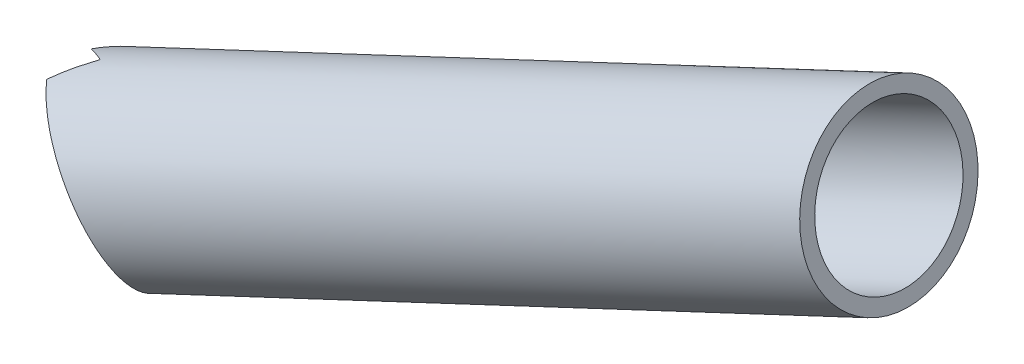
ISO-10303-21;
HEADER;
FILE_DESCRIPTION(('STEP AP214'),'2;1');
FILE_NAME('part.step','',(''),(''),'','','');
FILE_SCHEMA(('AUTOMOTIVE_DESIGN { 1 0 10303 214 1 1 1 1 }'));
ENDSEC;
DATA;
#1=APPLICATION_CONTEXT('core data for automotive mechanical design processes');
#2=APPLICATION_PROTOCOL_DEFINITION('international standard','automotive_design',2000,#1);
#3=PRODUCT_CONTEXT('',#1,'mechanical');
#4=PRODUCT('Part','Part','',(#3));
#5=PRODUCT_RELATED_PRODUCT_CATEGORY('part','',(#4));
#6=PRODUCT_DEFINITION_FORMATION('','',#4);
#7=PRODUCT_DEFINITION_CONTEXT('part definition',#1,'design');
#8=PRODUCT_DEFINITION('design','',#6,#7);
#9=PRODUCT_DEFINITION_SHAPE('','',#8);
#10=(LENGTH_UNIT() NAMED_UNIT(*) SI_UNIT(.MILLI.,.METRE.));
#11=(NAMED_UNIT(*) PLANE_ANGLE_UNIT() SI_UNIT($,.RADIAN.));
#12=(NAMED_UNIT(*) SI_UNIT($,.STERADIAN.) SOLID_ANGLE_UNIT());
#13=UNCERTAINTY_MEASURE_WITH_UNIT(LENGTH_MEASURE(1.E-05),#10,'distance_accuracy_value','');
#14=(GEOMETRIC_REPRESENTATION_CONTEXT(3) GLOBAL_UNCERTAINTY_ASSIGNED_CONTEXT((#13)) GLOBAL_UNIT_ASSIGNED_CONTEXT((#10,
#11,#12)) REPRESENTATION_CONTEXT('',''));
#15=CARTESIAN_POINT('',(0.,0.,0.));
#16=DIRECTION('',(0.,0.,1.));
#17=DIRECTION('',(1.,0.,0.));
#18=AXIS2_PLACEMENT_3D('',#15,#16,#17);
#19=CARTESIAN_POINT('',(-150.,499.999999999999,-1140.));
#20=DIRECTION('',(0.904818702200994,0.425797036329879,0.));
#21=DIRECTION('',(-0.425797036329879,0.904818702200994,0.));
#22=AXIS2_PLACEMENT_3D('',#19,#20,#21);
#23=CYLINDRICAL_SURFACE('',#22,7.90000000000002);
#24=CARTESIAN_POINT('',(-64.9999999999999,539.999999999999,-1140.));
#25=DIRECTION('',(0.975914622854119,0.218152810890676,0.));
#26=DIRECTION('',(-0.218152810890676,0.975914622854119,0.));
#27=AXIS2_PLACEMENT_3D('',#24,#25,#26);
#28=ELLIPSE('',#27,8.09497041544065,7.90000000000002);
#29=CARTESIAN_POINT('',(-66.7659405502051,547.899999999999,-1140.));
#30=VERTEX_POINT('',#29);
#31=EDGE_CURVE('E89',#30,#30,#28,.T.);
#32=ORIENTED_EDGE('',*,*,#31,.T.);
#33=EDGE_LOOP('',(#32));
#34=FACE_BOUND('',#33,.T.);
#35=CARTESIAN_POINT('',(-139.645473579607,502.874300322043,-1147.69027900345));
#36=CARTESIAN_POINT('',(-139.661307155204,502.71012741113,-1147.65692777421));
#37=CARTESIAN_POINT('',(-139.680305800371,502.547026325899,-1147.62000011917));
#38=CARTESIAN_POINT('',(-139.724004606069,502.22333632922,-1147.53943206389));
#39=CARTESIAN_POINT('',(-139.748702238356,502.062746337407,-1147.49579464316));
#40=CARTESIAN_POINT('',(-139.8031367204,501.744586324557,-1147.4023006833));
#41=CARTESIAN_POINT('',(-139.832864465143,501.58701140961,-1147.35245542328));
#42=CARTESIAN_POINT('',(-139.896817509264,501.274791150861,-1147.24681581513));
#43=CARTESIAN_POINT('',(-139.931043367525,501.120146173835,-1147.19102072791));
#44=CARTESIAN_POINT('',(-140.040383565727,500.657751620872,-1147.01393897515));
#45=CARTESIAN_POINT('',(-140.121593660903,500.354738724753,-1146.88390330433));
#46=CARTESIAN_POINT('',(-140.295862847536,499.762497282339,-1146.60210195336));
#47=CARTESIAN_POINT('',(-140.388926909799,499.473274589114,-1146.45032715386));
#48=CARTESIAN_POINT('',(-140.572909715701,498.938021989174,-1146.1415368896));
#49=CARTESIAN_POINT('',(-140.663112099239,498.690565254416,-1145.98656378264));
#50=CARTESIAN_POINT('',(-140.846185719115,498.208921163259,-1145.6584181483));
#51=CARTESIAN_POINT('',(-140.939057628674,497.974737199124,-1145.4852410003));
#52=CARTESIAN_POINT('',(-141.122805398781,497.522656478999,-1145.11984898213));
#53=CARTESIAN_POINT('',(-141.213688341121,497.304691414205,-1144.92772293803));
#54=CARTESIAN_POINT('',(-141.388267624243,496.887496000139,-1144.52146156504));
#55=CARTESIAN_POINT('',(-141.471973135809,496.688241711692,-1144.30735511395));
#56=CARTESIAN_POINT('',(-141.620473300655,496.324571581432,-1143.866631949));
#57=CARTESIAN_POINT('',(-141.686076278242,496.158814271204,-1143.64143330498));
#58=CARTESIAN_POINT('',(-141.768825677624,495.932395749011,-1143.28622700343));
#59=CARTESIAN_POINT('',(-141.793784279502,495.860680080498,-1143.1650397096));
#60=CARTESIAN_POINT('',(-141.837584240635,495.72573613113,-1142.91699919496));
#61=CARTESIAN_POINT('',(-141.856428723112,495.662503526658,-1142.79014890472));
#62=CARTESIAN_POINT('',(-141.887431689922,495.544956008496,-1142.52970596897));
#63=CARTESIAN_POINT('',(-141.899507121549,495.490757369196,-1142.39605062616));
#64=CARTESIAN_POINT('',(-141.916187868538,495.393255121579,-1142.12436686557));
#65=CARTESIAN_POINT('',(-141.920793739748,495.34995070277,-1141.98633877396));
#66=CARTESIAN_POINT('',(-141.922598374132,495.274884129779,-1141.70702707154));
#67=CARTESIAN_POINT('',(-141.919791792432,495.243130323145,-1141.56574118445));
#68=CARTESIAN_POINT('',(-141.90733422828,495.191408192572,-1141.28132934233));
#69=CARTESIAN_POINT('',(-141.897682329564,495.171441447016,-1141.1382031435));
#70=CARTESIAN_POINT('',(-141.871245588861,495.141629765395,-1140.83700672316));
#71=CARTESIAN_POINT('',(-141.853844355027,495.132995637518,-1140.67887235381));
#72=CARTESIAN_POINT('',(-141.813527270325,495.128903417962,-1140.36316278244));
#73=CARTESIAN_POINT('',(-141.790610542396,495.133447423108,-1140.20558767341));
#74=CARTESIAN_POINT('',(-141.740859187123,495.154717428475,-1139.89154126218));
#75=CARTESIAN_POINT('',(-141.714015564048,495.171471760757,-1139.73507338318));
#76=CARTESIAN_POINT('',(-141.657988649044,495.216147069046,-1139.42414740877));
#77=CARTESIAN_POINT('',(-141.628804560914,495.244071858119,-1139.26969001825));
#78=CARTESIAN_POINT('',(-141.556116407045,495.324993116705,-1138.89413881998));
#79=CARTESIAN_POINT('',(-141.51208084293,495.383617057423,-1138.67435268638));
#80=CARTESIAN_POINT('',(-141.425458854648,495.519855052602,-1138.24043717962));
#81=CARTESIAN_POINT('',(-141.382873033906,495.597476907068,-1138.02631017004));
#82=CARTESIAN_POINT('',(-141.30189156693,495.769857535135,-1137.60413235333));
#83=CARTESIAN_POINT('',(-141.263498088428,495.864625107606,-1137.39608472999));
#84=CARTESIAN_POINT('',(-141.193184670489,496.069788618251,-1136.98675382021));
#85=CARTESIAN_POINT('',(-141.161263887154,496.1801825159,-1136.78546965481));
#86=CARTESIAN_POINT('',(-141.105107029443,496.418285032886,-1136.38552378724));
#87=CARTESIAN_POINT('',(-141.081076349105,496.546348963318,-1136.18704440767));
#88=CARTESIAN_POINT('',(-141.043536568812,496.816538465366,-1135.79882516468));
#89=CARTESIAN_POINT('',(-141.030027890364,496.958664600049,-1135.60908565166));
#90=CARTESIAN_POINT('',(-141.015061064945,497.255820040646,-1135.23963864021));
#91=CARTESIAN_POINT('',(-141.013596185641,497.410842088942,-1135.05992559293));
#92=CARTESIAN_POINT('',(-141.024007385844,497.732714796871,-1134.71181290178));
#93=CARTESIAN_POINT('',(-141.035882887993,497.899564944302,-1134.54341276864));
#94=CARTESIAN_POINT('',(-141.073856612191,498.242094137159,-1134.22109127857));
#95=CARTESIAN_POINT('',(-141.099812034216,498.417668725494,-1134.06704244654));
#96=CARTESIAN_POINT('',(-141.16662154066,498.777701874792,-1133.77316601914));
#97=CARTESIAN_POINT('',(-141.207475824391,498.962160554574,-1133.63333861406));
#98=CARTESIAN_POINT('',(-141.304484312129,499.338114556635,-1133.369647034));
#99=CARTESIAN_POINT('',(-141.360626159607,499.529604088384,-1133.24577008528));
#100=CARTESIAN_POINT('',(-141.488278982357,499.917834743603,-1133.01539865237));
#101=CARTESIAN_POINT('',(-141.559787416228,500.114574993975,-1132.90890129896));
#102=CARTESIAN_POINT('',(-141.706871275851,500.483805031206,-1132.72803872424));
#103=CARTESIAN_POINT('',(-141.78051979693,500.655889793574,-1132.65126696393));
#104=CARTESIAN_POINT('',(-141.9384615847,501.001045932212,-1132.51227382164));
#105=CARTESIAN_POINT('',(-142.022754216039,501.174117249006,-1132.45005157181));
#106=CARTESIAN_POINT('',(-142.201255829848,501.519834818527,-1132.34064069019));
#107=CARTESIAN_POINT('',(-142.295462499157,501.692481160832,-1132.29344856184));
#108=CARTESIAN_POINT('',(-142.492914103158,502.036090242067,-1132.21432713645));
#109=CARTESIAN_POINT('',(-142.596159059315,502.207052976998,-1132.18239787566));
#110=CARTESIAN_POINT('',(-142.805321184378,502.537696966149,-1132.13504249225));
#111=CARTESIAN_POINT('',(-142.910852673869,502.697517564329,-1132.11887725525));
#112=CARTESIAN_POINT('',(-143.128183747967,503.01372307368,-1132.10023471345));
#113=CARTESIAN_POINT('',(-143.23998534298,503.170106860264,-1132.09776182451));
#114=CARTESIAN_POINT('',(-143.46873771786,503.478569990054,-1132.10625970967));
#115=CARTESIAN_POINT('',(-143.585686308629,503.630651118888,-1132.11722482065));
#116=CARTESIAN_POINT('',(-143.8237628769,503.93004740114,-1132.15224832559));
#117=CARTESIAN_POINT('',(-143.944892659147,504.077360441961,-1132.17631244142));
#118=CARTESIAN_POINT('',(-144.199517574784,504.377686354615,-1132.23944218337));
#119=CARTESIAN_POINT('',(-144.333253931681,504.530284583174,-1132.27950685318));
#120=CARTESIAN_POINT('',(-144.602882634677,504.828961685681,-1132.37378378228));
#121=CARTESIAN_POINT('',(-144.738774350715,504.975042418905,-1132.42799197615));
#122=CARTESIAN_POINT('',(-145.011599451847,505.260758382668,-1132.55013683425));
#123=CARTESIAN_POINT('',(-145.148534056108,505.400384018759,-1132.61809317485));
#124=CARTESIAN_POINT('',(-145.421815837584,505.672907619436,-1132.76720427189));
#125=CARTESIAN_POINT('',(-145.558163144479,505.805807147087,-1132.84835594325));
#126=CARTESIAN_POINT('',(-145.847813835459,506.083226129622,-1133.03578117585));
#127=CARTESIAN_POINT('',(-146.000815191119,506.226763357296,-1133.1439816189));
#128=CARTESIAN_POINT('',(-146.30177987659,506.505747534545,-1133.37671562122));
#129=CARTESIAN_POINT('',(-146.44974180486,506.641192241239,-1133.50125367825));
#130=CARTESIAN_POINT('',(-146.737616343318,506.904509729995,-1133.76639714296));
#131=CARTESIAN_POINT('',(-146.877534124914,507.032387378337,-1133.90699205039));
#132=CARTESIAN_POINT('',(-147.145713288306,507.28138249619,-1134.20414305214));
#133=CARTESIAN_POINT('',(-147.27398106574,507.40250366062,-1134.36069028752));
#134=CARTESIAN_POINT('',(-147.546273817354,507.670417757119,-1134.73353185097));
#135=CARTESIAN_POINT('',(-147.685506482832,507.815537197245,-1134.95468319777));
#136=CARTESIAN_POINT('',(-147.865750516245,508.027431941567,-1135.30420647574));
#137=CARTESIAN_POINT('',(-147.921036662189,508.09705438206,-1135.42359365649));
#138=CARTESIAN_POINT('',(-148.020452953989,508.234560542035,-1135.66785303029));
#139=CARTESIAN_POINT('',(-148.064589328894,508.302445213221,-1135.79272211478));
#140=CARTESIAN_POINT('',(-148.140643183789,508.437400059815,-1136.04887711584));
#141=CARTESIAN_POINT('',(-148.172389176968,508.504447165304,-1136.18022655716));
#142=CARTESIAN_POINT('',(-148.221507577306,508.636626200849,-1136.44653468022));
#143=CARTESIAN_POINT('',(-148.23888155424,508.701758339317,-1136.58149296613));
#144=CARTESIAN_POINT('',(-148.258615516556,508.829796187347,-1136.85349939495));
#145=CARTESIAN_POINT('',(-148.260980020273,508.892702561266,-1136.99054689647));
#146=CARTESIAN_POINT('',(-148.25089536567,509.015934115824,-1137.26525091667));
#147=CARTESIAN_POINT('',(-148.238444534034,509.076259004102,-1137.40290750238));
#148=CARTESIAN_POINT('',(-148.198492529316,509.197519018865,-1137.68584582762));
#149=CARTESIAN_POINT('',(-148.170123001086,509.258268585803,-1137.8310827667));
#150=CARTESIAN_POINT('',(-148.09949159094,509.37608967842,-1138.11972314552));
#151=CARTESIAN_POINT('',(-148.057219926869,509.433158580302,-1138.26312522014));
#152=CARTESIAN_POINT('',(-147.960634604095,509.543452532074,-1138.54777590819));
#153=CARTESIAN_POINT('',(-147.906288482956,509.596666697099,-1138.68901759806));
#154=CARTESIAN_POINT('',(-147.787545963655,509.698878179848,-1138.96869017975));
#155=CARTESIAN_POINT('',(-147.723151315213,509.747876229411,-1139.10712155617));
#156=CARTESIAN_POINT('',(-147.536770887584,509.875166038538,-1139.47967312499));
#157=CARTESIAN_POINT('',(-147.40662275765,509.94924149867,-1139.71115951735));
#158=CARTESIAN_POINT('',(-147.12836578893,510.084072259983,-1140.16713800834));
#159=CARTESIAN_POINT('',(-146.980243135843,510.144817214032,-1140.39162455857));
#160=CARTESIAN_POINT('',(-146.670363184728,510.252468441108,-1140.83527415862));
#161=CARTESIAN_POINT('',(-146.508571474671,510.299338363347,-1141.05442186834));
#162=CARTESIAN_POINT('',(-146.175110240756,510.378200550365,-1141.48767543041));
#163=CARTESIAN_POINT('',(-146.003443733003,510.410197331085,-1141.70178279438));
#164=CARTESIAN_POINT('',(-145.636242258468,510.460546922052,-1142.14553748006));
#165=CARTESIAN_POINT('',(-145.439978155325,510.47733999318,-1142.37476062723));
#166=CARTESIAN_POINT('',(-145.041122789293,510.490172479031,-1142.828414778));
#167=CARTESIAN_POINT('',(-144.8385292525,510.486204347869,-1143.05284400945));
#168=CARTESIAN_POINT('',(-144.43036205107,510.455420516168,-1143.49555252727));
#169=CARTESIAN_POINT('',(-144.224805939892,510.428707902269,-1143.71385497838));
#170=CARTESIAN_POINT('',(-143.812319340765,510.350044340734,-1144.14434957586));
#171=CARTESIAN_POINT('',(-143.605390390385,510.298118056405,-1144.35654747911));
#172=CARTESIAN_POINT('',(-143.34058357749,510.21343099968,-1144.6240350278));
#173=CARTESIAN_POINT('',(-143.282058425842,510.193564264822,-1144.68289651437));
#174=CARTESIAN_POINT('',(-143.165170002748,510.151487972767,-1144.79996442087));
#175=CARTESIAN_POINT('',(-143.106806767617,510.129277927708,-1144.8581707016));
#176=CARTESIAN_POINT('',(-143.048560840608,510.105860751672,-1144.91602308416));
#177=B_SPLINE_CURVE_WITH_KNOTS('',3,(#35,#36,#37,#38,#39,#40,#41,#42,#43,#44,#45,#46,#47,#48,
#49,#50,#51,#52,#53,#54,#55,#56,#57,#58,#59,#60,#61,#62,#63,#64,#65,#66,#67,#68,#69,#70,#71,#72,
#73,#74,#75,#76,#77,#78,#79,#80,#81,#82,#83,#84,#85,#86,#87,#88,#89,#90,#91,#92,#93,#94,#95,#96,
#97,#98,#99,#100,#101,#102,#103,#104,#105,#106,#107,#108,#109,#110,#111,#112,#113,#114,#115,
#116,#117,#118,#119,#120,#121,#122,#123,#124,#125,#126,#127,#128,#129,#130,#131,#132,#133,#134,
#135,#136,#137,#138,#139,#140,#141,#142,#143,#144,#145,#146,#147,#148,#149,#150,#151,#152,#153,
#154,#155,#156,#157,#158,#159,#160,#161,#162,#163,#164,#165,#166,#167,#168,#169,#170,#171,#172,
#173,#174,#175,#176),.UNSPECIFIED.,.F.,.F.,(4,2,2,2,2,2,2,2,2,2,2,2,2,2,2,2,2,2,2,2,2,2,2,2,2,2,
2,2,2,2,2,2,2,2,2,2,2,2,2,2,2,2,2,2,2,2,2,2,2,2,2,2,2,2,2,2,2,2,2,2,2,2,2,2,2,2,2,2,2,2,4),(0.,
0.504689940522103,1.00915641407151,1.51271933369541,2.01634487946512,3.03370178150453,
4.05148671205757,4.96747761663792,5.88370158483367,6.79581813954233,7.70675133202913,
8.56553089212307,8.99415431201442,9.42255843592537,9.85610983800376,10.2896289758291,
10.7234607953608,11.1573506953677,11.6345976065853,12.1119204586059,12.59035440052,
13.068951796683,13.7630266836225,14.4573870174605,15.1521047003559,15.8467317488391,
16.558223696282,17.2697441443273,17.980866834327,18.6919587487709,19.3959699746089,
20.0999906188603,20.8034439025705,21.5067809351121,22.112943659301,22.7190702184326,
23.3250556673262,23.9310425553299,24.5070129382199,25.0831690643088,25.6590824664374,
26.2352476395979,26.8550959264346,27.4747662405064,28.0953297833203,28.7157484464044,
29.4231271231462,30.1307009523735,30.8378146906215,31.5445378599344,32.4380052589643,
32.884136772699,33.3300184919239,33.7818693197738,34.2336707879698,34.6853362429519,
35.1370527160477,35.6162108807121,36.0957069261243,36.5765080513605,37.0572255494071,
37.8829754141155,38.7093639759207,39.5378987880848,40.3661818671214,41.2720909807656,
42.1783293797676,43.0804820933895,43.9817541187359,44.2377770566101,44.4938534022914),.UNSPECIFIED.);
#178=CARTESIAN_POINT('',(-141.903149365729,495.185987199563,-1141.23149369237));
#179=VERTEX_POINT('',#178);
#180=CARTESIAN_POINT('',(-147.127608681562,510.080894448992,-1140.16261756922));
#181=VERTEX_POINT('',#180);
#182=EDGE_CURVE('E81',#179,#181,#177,.T.);
#183=ORIENTED_EDGE('',*,*,#182,.T.);
#184=CARTESIAN_POINT('',(-144.773629099719,510.792689584157,-1137.64254723796));
#185=CARTESIAN_POINT('',(-144.894550147006,510.773202176738,-1137.75086642676));
#186=CARTESIAN_POINT('',(-145.014383919085,510.751718047242,-1137.86004894071));
#187=CARTESIAN_POINT('',(-145.251504231087,510.704877209923,-1138.08037599846));
#188=CARTESIAN_POINT('',(-145.36879029062,510.679519778878,-1138.19152090524));
#189=CARTESIAN_POINT('',(-145.601054361042,510.624906011776,-1138.41660483951));
#190=CARTESIAN_POINT('',(-145.716015490553,510.5956283602,-1138.53055614664));
#191=CARTESIAN_POINT('',(-145.94242416677,510.533381721917,-1138.76090861243));
#192=CARTESIAN_POINT('',(-146.053871895372,510.500412926714,-1138.87730964374));
#193=CARTESIAN_POINT('',(-146.276438659409,510.429644705485,-1139.11697368861));
#194=CARTESIAN_POINT('',(-146.387412006002,510.391717325564,-1139.24033464204));
#195=CARTESIAN_POINT('',(-146.604072797049,510.312033951516,-1139.4904122352));
#196=CARTESIAN_POINT('',(-146.709760718026,510.270278303502,-1139.61712857084));
#197=CARTESIAN_POINT('',(-146.914555775502,510.183048748402,-1139.87407589532));
#198=CARTESIAN_POINT('',(-147.013676753269,510.137583143921,-1140.00429862173));
#199=CARTESIAN_POINT('',(-147.204210389894,510.042862188028,-1140.26890235878));
#200=CARTESIAN_POINT('',(-147.295625661004,509.993608131825,-1140.40328193896));
#201=CARTESIAN_POINT('',(-147.459806888036,509.896764128716,-1140.66191471076));
#202=CARTESIAN_POINT('',(-147.533521478479,509.849562204404,-1140.78570835212));
#203=CARTESIAN_POINT('',(-147.672105223268,509.752087846162,-1141.03702801337));
#204=CARTESIAN_POINT('',(-147.736973988203,509.701815277196,-1141.16455419727));
#205=CARTESIAN_POINT('',(-147.855834350227,509.598604219455,-1141.42220291951));
#206=CARTESIAN_POINT('',(-147.909907231937,509.54568971971,-1141.55229726636));
#207=CARTESIAN_POINT('',(-148.006250675066,509.436863103316,-1141.81559622125));
#208=CARTESIAN_POINT('',(-148.0485218164,509.380951134118,-1141.94880067612));
#209=CARTESIAN_POINT('',(-148.12041723051,509.265341031372,-1142.21947173775));
#210=CARTESIAN_POINT('',(-148.149845666443,509.205599201039,-1142.35697223332));
#211=CARTESIAN_POINT('',(-148.194167442946,509.083191426649,-1142.63301597634));
#212=CARTESIAN_POINT('',(-148.209061771331,509.02052568162,-1142.77155915228));
#213=CARTESIAN_POINT('',(-148.22407146082,508.892272800262,-1143.04833016123));
#214=CARTESIAN_POINT('',(-148.224165804805,508.826681641739,-1143.18655726706));
#215=CARTESIAN_POINT('',(-148.210040610574,508.692709901328,-1143.46090887158));
#216=CARTESIAN_POINT('',(-148.195819206999,508.62432895704,-1143.59703309391));
#217=CARTESIAN_POINT('',(-148.15277733156,508.479966883939,-1143.87498886233));
#218=CARTESIAN_POINT('',(-148.123021377224,508.403786309256,-1144.01657040002));
#219=CARTESIAN_POINT('',(-148.050331103527,508.248094879339,-1144.29438775775));
#220=CARTESIAN_POINT('',(-148.007395293422,508.16858364826,-1144.43062297112));
#221=CARTESIAN_POINT('',(-147.910244979426,508.005861201994,-1144.69711246504));
#222=CARTESIAN_POINT('',(-147.856006616054,507.922642457289,-1144.82735336999));
#223=CARTESIAN_POINT('',(-147.738207019703,507.752409883656,-1145.08097897557));
#224=CARTESIAN_POINT('',(-147.674642869624,507.665394873264,-1145.2043615142));
#225=CARTESIAN_POINT('',(-147.516329568103,507.456173909152,-1145.48577868791));
#226=CARTESIAN_POINT('',(-147.418451958461,507.332309853185,-1145.64082842406));
#227=CARTESIAN_POINT('',(-147.212407932322,507.07675243591,-1145.93703227907));
#228=CARTESIAN_POINT('',(-147.104238415951,506.945056720249,-1146.07818218514));
#229=CARTESIAN_POINT('',(-146.880516583609,506.673513156074,-1146.34605399546));
#230=CARTESIAN_POINT('',(-146.764963931542,506.533664936464,-1146.47277524213));
#231=CARTESIAN_POINT('',(-146.528890532158,506.245669165571,-1146.71126938425));
#232=CARTESIAN_POINT('',(-146.408369750774,506.097521557372,-1146.82304217717));
#233=CARTESIAN_POINT('',(-146.16271316789,505.790834213151,-1147.03254559082));
#234=CARTESIAN_POINT('',(-146.037536408964,505.632178178938,-1147.13005813873));
#235=CARTESIAN_POINT('',(-145.786089835907,505.306621357479,-1147.30853455684));
#236=CARTESIAN_POINT('',(-145.659819998261,505.139720392502,-1147.38949807012));
#237=CARTESIAN_POINT('',(-145.407963439069,504.798212074585,-1147.53421554886));
#238=CARTESIAN_POINT('',(-145.282376490546,504.623607483505,-1147.5979756246));
#239=CARTESIAN_POINT('',(-145.033448026265,504.267341926771,-1147.70771477181));
#240=CARTESIAN_POINT('',(-144.910106477661,504.085681064459,-1147.75369410358));
#241=CARTESIAN_POINT('',(-144.666517172405,503.71523601526,-1147.82753483696));
#242=CARTESIAN_POINT('',(-144.546289607917,503.526418789244,-1147.85529752791));
#243=CARTESIAN_POINT('',(-144.311045402158,503.143754252864,-1147.89188881551));
#244=CARTESIAN_POINT('',(-144.196028830927,502.949906874945,-1147.90071715773));
#245=CARTESIAN_POINT('',(-143.972540747813,502.55860695572,-1147.89919198809));
#246=CARTESIAN_POINT('',(-143.86406757672,502.361155345022,-1147.88884336022));
#247=CARTESIAN_POINT('',(-143.654792709693,501.964144785758,-1147.84893614489));
#248=CARTESIAN_POINT('',(-143.553990503234,501.764585978442,-1147.81937883707));
#249=CARTESIAN_POINT('',(-143.36793727575,501.379333704354,-1147.74405523103));
#250=CARTESIAN_POINT('',(-143.282089566393,501.193670424225,-1147.69960087768));
#251=CARTESIAN_POINT('',(-143.118451409205,500.823338891406,-1147.5946517225));
#252=CARTESIAN_POINT('',(-143.040660533356,500.638670586353,-1147.53415777338));
#253=CARTESIAN_POINT('',(-142.893582528221,500.271742443968,-1147.39764233229));
#254=CARTESIAN_POINT('',(-142.824294205198,500.089482271753,-1147.32162302405));
#255=CARTESIAN_POINT('',(-142.694458897738,499.728708582839,-1147.15469568545));
#256=CARTESIAN_POINT('',(-142.63391202005,499.550195111916,-1147.06378747331));
#257=CARTESIAN_POINT('',(-142.522226085555,499.200130399391,-1146.86889370513));
#258=CARTESIAN_POINT('',(-142.470992884818,499.028524940663,-1146.76505924875));
#259=CARTESIAN_POINT('',(-142.377017478583,498.691488289463,-1146.54436550532));
#260=CARTESIAN_POINT('',(-142.334275170933,498.526057022729,-1146.42750637498));
#261=CARTESIAN_POINT('',(-142.256966319769,498.202469533998,-1146.1815684471));
#262=CARTESIAN_POINT('',(-142.222401923843,498.044315231755,-1146.05248645215));
#263=CARTESIAN_POINT('',(-142.160977280187,497.736407203412,-1145.78296408778));
#264=CARTESIAN_POINT('',(-142.134117563835,497.586654057295,-1145.6425229358));
#265=CARTESIAN_POINT('',(-142.086003928614,497.287682272875,-1145.34213696576));
#266=CARTESIAN_POINT('',(-142.065196356045,497.139062909769,-1145.1815238559));
#267=CARTESIAN_POINT('',(-142.030479836073,496.853724266311,-1144.84933376443));
#268=CARTESIAN_POINT('',(-142.01657159974,496.717006213749,-1144.6777556548));
#269=CARTESIAN_POINT('',(-141.994331774164,496.456734608626,-1144.32442207558));
#270=CARTESIAN_POINT('',(-141.986002827559,496.33318731768,-1144.14266182731));
#271=CARTESIAN_POINT('',(-141.973275401856,496.100796706015,-1143.76985949735));
#272=CARTESIAN_POINT('',(-141.968876209864,495.99195072139,-1143.57881910579));
#273=CARTESIAN_POINT('',(-141.962542160646,495.808856595661,-1143.22359940214));
#274=CARTESIAN_POINT('',(-141.960305478855,495.731911609266,-1143.06081215487));
#275=CARTESIAN_POINT('',(-141.955648284799,495.590110173416,-1142.73006301245));
#276=CARTESIAN_POINT('',(-141.953227807565,495.525251428481,-1142.56210210698));
#277=CARTESIAN_POINT('',(-141.946533999161,495.408956238343,-1142.2218954505));
#278=CARTESIAN_POINT('',(-141.942263544181,495.357499155412,-1142.04965674053));
#279=CARTESIAN_POINT('',(-141.929935032188,495.269284015089,-1141.70157991745));
#280=CARTESIAN_POINT('',(-141.921878159302,495.232521368952,-1141.52574294606));
#281=CARTESIAN_POINT('',(-141.902421268847,495.181753636431,-1141.21284208222));
#282=CARTESIAN_POINT('',(-141.892228772439,495.164448913169,-1141.07623656292));
#283=CARTESIAN_POINT('',(-141.867419702567,495.139899774987,-1140.80253638355));
#284=CARTESIAN_POINT('',(-141.852804390991,495.132652493837,-1140.66544187402));
#285=CARTESIAN_POINT('',(-141.818345274476,495.128600417629,-1140.39197255838));
#286=CARTESIAN_POINT('',(-141.798510195334,495.131778295726,-1140.25559693504));
#287=CARTESIAN_POINT('',(-141.75299978795,495.148641681415,-1139.98447063286));
#288=CARTESIAN_POINT('',(-141.727324499925,495.162327116653,-1139.84971994283));
#289=CARTESIAN_POINT('',(-141.669819086856,495.199986503332,-1139.58280452117));
#290=CARTESIAN_POINT('',(-141.637980641912,495.22397441647,-1139.45064355412));
#291=CARTESIAN_POINT('',(-141.568258611459,495.281648330832,-1139.19009885501));
#292=CARTESIAN_POINT('',(-141.530374950594,495.315334452952,-1139.06171517006));
#293=CARTESIAN_POINT('',(-141.448916248712,495.391600929465,-1138.80929295232));
#294=CARTESIAN_POINT('',(-141.405333746543,495.434192988444,-1138.68526039101));
#295=CARTESIAN_POINT('',(-141.31313834252,495.527264941506,-1138.44210454823));
#296=CARTESIAN_POINT('',(-141.264523687897,495.577747587133,-1138.32298299767));
#297=CARTESIAN_POINT('',(-141.13624949905,495.714021113319,-1138.02835472067));
#298=CARTESIAN_POINT('',(-141.053729087202,495.804400645652,-1137.8562099203));
#299=CARTESIAN_POINT('',(-140.881326831044,495.998062518691,-1137.52323511066));
#300=CARTESIAN_POINT('',(-140.791440049319,496.101353538273,-1137.36241282695));
#301=CARTESIAN_POINT('',(-140.606195654234,496.318917892509,-1137.05029297683));
#302=CARTESIAN_POINT('',(-140.510812499425,496.433244502764,-1136.89904811596));
#303=CARTESIAN_POINT('',(-140.316933195027,496.670623646483,-1136.6058205341));
#304=CARTESIAN_POINT('',(-140.218437769134,496.793674159536,-1136.46383568308));
#305=CARTESIAN_POINT('',(-140.024630603926,497.041165559532,-1136.19465864214));
#306=CARTESIAN_POINT('',(-139.929395127285,497.165251691912,-1136.06708315848));
#307=CARTESIAN_POINT('',(-139.738502150839,497.41952712328,-1135.81849217744));
#308=CARTESIAN_POINT('',(-139.64284461664,497.549716928305,-1135.69747722577));
#309=CARTESIAN_POINT('',(-139.453393459439,497.813746459886,-1135.46311200503));
#310=CARTESIAN_POINT('',(-139.359593024537,497.947505059468,-1135.34967557902));
#311=CARTESIAN_POINT('',(-139.173195847693,498.220110263948,-1135.12818870449));
#312=CARTESIAN_POINT('',(-139.080598644796,498.358954837612,-1135.02013614559));
#313=CARTESIAN_POINT('',(-138.988939419425,498.50022401353,-1134.91454017282));
#314=B_SPLINE_CURVE_WITH_KNOTS('',3,(#184,#185,#186,#187,#188,#189,#190,#191,#192,#193,#194,
#195,#196,#197,#198,#199,#200,#201,#202,#203,#204,#205,#206,#207,#208,#209,#210,#211,#212,#213,
#214,#215,#216,#217,#218,#219,#220,#221,#222,#223,#224,#225,#226,#227,#228,#229,#230,#231,#232,
#233,#234,#235,#236,#237,#238,#239,#240,#241,#242,#243,#244,#245,#246,#247,#248,#249,#250,#251,
#252,#253,#254,#255,#256,#257,#258,#259,#260,#261,#262,#263,#264,#265,#266,#267,#268,#269,#270,
#271,#272,#273,#274,#275,#276,#277,#278,#279,#280,#281,#282,#283,#284,#285,#286,#287,#288,#289,
#290,#291,#292,#293,#294,#295,#296,#297,#298,#299,#300,#301,#302,#303,#304,#305,#306,#307,#308,
#309,#310,#311,#312,#313),.UNSPECIFIED.,.F.,.F.,(4,2,2,2,2,2,2,2,2,2,2,2,2,2,2,2,2,2,2,2,2,2,2,
2,2,2,2,2,2,2,2,2,2,2,2,2,2,2,2,2,2,2,2,2,2,2,2,2,2,2,2,2,2,2,2,2,2,2,2,2,2,2,2,2,4),(0.,
0.490513085271806,0.981117871440265,1.47450763947281,1.96787182149283,2.47836125236746,
2.98880457535793,3.49813534629679,4.00729275266168,4.46184586132343,4.91641897385646,
5.36742847186858,5.81841580423324,6.27605841042839,6.73366991056423,7.19193124841374,
7.65025230604961,8.1400472297665,8.62989757347933,9.12079265195714,9.61184161081787,
10.2747460416459,10.9378507721446,11.6009857102482,12.2641251965008,12.9365322188423,
13.6089537422414,14.2811361214937,14.9533086601389,15.6290940683913,16.3048885572141,
16.980510958165,17.6560883550998,18.2832992406764,18.910476788583,19.5375661812384,
20.1646632312027,20.7850184615982,21.4053662281161,22.0258767226246,22.6464300021679,
23.3051472799001,23.9639324333955,24.6230294013434,25.282006778851,25.8217833583836,
26.3614573160669,26.9002952286152,27.4389647423384,27.8527954387316,28.2665081749056,
28.6795336599598,29.0925563009631,29.5061404362296,29.919729727323,30.333866031679,
30.7481470740127,31.3807147169822,32.0137098707523,32.6499302649458,33.2860037920457,
33.891329289566,34.4967050616744,35.0932352921688,35.689529823874),.UNSPECIFIED.);
#315=EDGE_CURVE('E79',#181,#179,#314,.T.);
#316=ORIENTED_EDGE('',*,*,#315,.T.);
#317=EDGE_LOOP('',(#183,#316));
#318=FACE_BOUND('',#317,.T.);
#319=ADVANCED_FACE('F39',(#34,#318),#23,.F.);
#320=CARTESIAN_POINT('',(-65.,540.,-1140.));
#321=DIRECTION('',(0.975914622854119,0.218152810890676,0.));
#322=DIRECTION('',(-0.218152810890676,0.975914622854119,0.));
#323=AXIS2_PLACEMENT_3D('',#320,#321,#322);
#324=PLANE('',#323);
#325=ORIENTED_EDGE('',*,*,#31,.F.);
#326=EDGE_LOOP('',(#325));
#327=FACE_BOUND('',#326,.T.);
#328=CARTESIAN_POINT('',(-64.9999999999999,539.999999999999,-1140.));
#329=DIRECTION('',(0.975914622854119,0.218152810890676,0.));
#330=DIRECTION('',(-0.218152810890676,0.975914622854119,0.));
#331=AXIS2_PLACEMENT_3D('',#328,#329,#330);
#332=ELLIPSE('',#331,9.73445809451721,9.49999999999999);
#333=CARTESIAN_POINT('',(-67.1235993958163,549.499999999999,-1140.));
#334=VERTEX_POINT('',#333);
#335=EDGE_CURVE('E88',#334,#334,#332,.T.);
#336=ORIENTED_EDGE('',*,*,#335,.T.);
#337=EDGE_LOOP('',(#336));
#338=FACE_BOUND('',#337,.T.);
#339=ADVANCED_FACE('F41',(#327,#338),#324,.T.);
#340=CARTESIAN_POINT('',(-150.,499.999999999999,-1140.));
#341=DIRECTION('',(0.904818702200994,0.425797036329879,0.));
#342=DIRECTION('',(-0.425797036329879,0.904818702200994,0.));
#343=AXIS2_PLACEMENT_3D('',#340,#341,#342);
#344=CYLINDRICAL_SURFACE('',#343,9.49999999999999);
#345=ORIENTED_EDGE('',*,*,#335,.F.);
#346=EDGE_LOOP('',(#345));
#347=FACE_BOUND('',#346,.T.);
#348=CARTESIAN_POINT('',(-150.,500.,-1140.));
#349=DIRECTION('',(0.661636513716334,0.0238473310187051,0.749445413969943));
#350=DIRECTION('',(0.632795525843136,0.518432072130128,-0.575150422984954));
#351=AXIS2_PLACEMENT_3D('',#348,#349,#350);
#352=ELLIPSE('',#351,15.6040778434728,9.49999999999999);
#353=CARTESIAN_POINT('',(-153.821397243636,508.120469142725,-1136.88473050791));
#354=VERTEX_POINT('',#353);
#355=CARTESIAN_POINT('',(-150.750146002883,510.139619946227,-1139.6603873903));
#356=VERTEX_POINT('',#355);
#357=EDGE_CURVE('E11',#354,#356,#352,.F.);
#358=ORIENTED_EDGE('',*,*,#357,.F.);
#359=CARTESIAN_POINT('',(-150.,500.,-1140.));
#360=DIRECTION('',(0.632795525843136,0.518432072130128,-0.575150422984954));
#361=DIRECTION('',(0.661636513716334,0.0238473310187051,0.749445413969943));
#362=AXIS2_PLACEMENT_3D('',#359,#360,#361);
#363=ELLIPSE('',#362,11.9751109349285,9.49999999999999);
#364=CARTESIAN_POINT('',(-144.44612585051,492.166890178091,-1140.95013168984));
#365=VERTEX_POINT('',#364);
#366=EDGE_CURVE('E72',#365,#354,#363,.F.);
#367=ORIENTED_EDGE('',*,*,#366,.F.);
#368=CARTESIAN_POINT('',(-150.,500.,-1140.));
#369=DIRECTION('',(0.730698843528213,0.456511552407961,0.507618363127858));
#370=DIRECTION('',(0.540188066054772,0.0680580566202291,-0.838787788550288));
#371=AXIS2_PLACEMENT_3D('',#368,#369,#370);
#372=ELLIPSE('',#371,11.1042116245899,9.49999999999999);
#373=CARTESIAN_POINT('',(-153.965906430516,508.427551164846,-1141.87028541894));
#374=VERTEX_POINT('',#373);
#375=EDGE_CURVE('E84',#374,#365,#372,.F.);
#376=ORIENTED_EDGE('',*,*,#375,.F.);
#377=CARTESIAN_POINT('',(-150.,500.,-1140.));
#378=DIRECTION('',(0.540188066054772,0.0680580566202291,-0.838787788550288));
#379=DIRECTION('',(0.730698843528213,0.456511552407961,0.507618363127858));
#380=AXIS2_PLACEMENT_3D('',#377,#378,#379);
#381=ELLIPSE('',#380,18.3485819047058,9.49999999999999);
#382=EDGE_CURVE('E47',#356,#374,#381,.F.);
#383=ORIENTED_EDGE('',*,*,#382,.F.);
#384=EDGE_LOOP('',(#358,#367,#376,#383));
#385=FACE_BOUND('',#384,.T.);
#386=ADVANCED_FACE('F83',(#347,#385),#344,.T.);
#387=CARTESIAN_POINT('',(-150.,500.,-1140.));
#388=DIRECTION('',(-0.0991899501072693,-0.396759800429077,0.912547540986877));
#389=DIRECTION('',(0.,-0.917070056253235,-0.39872611141445));
#390=AXIS2_PLACEMENT_3D('',#387,#388,#389);
#391=CYLINDRICAL_SURFACE('',#390,9.49999999999999);
#392=CARTESIAN_POINT('',(-150.,500.,-1140.));
#393=DIRECTION('',(0.136924020573454,-0.0230393226257373,0.990313587810925));
#394=DIRECTION('',(0.508281006832033,0.859722512143853,-0.0502754433782236));
#395=AXIS2_PLACEMENT_3D('',#392,#393,#394);
#396=ELLIPSE('',#395,10.5641498478138,9.49999999999999);
#397=EDGE_CURVE('E59',#365,#179,#396,.T.);
#398=ORIENTED_EDGE('',*,*,#397,.F.);
#399=ORIENTED_EDGE('',*,*,#366,.T.);
#400=ORIENTED_EDGE('',*,*,#357,.T.);
#401=EDGE_CURVE('E53',#181,#356,#396,.T.);
#402=ORIENTED_EDGE('',*,*,#401,.F.);
#403=ORIENTED_EDGE('',*,*,#182,.F.);
#404=EDGE_LOOP('',(#398,#399,#400,#402,#403));
#405=FACE_BOUND('',#404,.T.);
#406=ADVANCED_FACE('F70',(#405),#391,.F.);
#407=CARTESIAN_POINT('',(-325.,320.,-1580.));
#408=DIRECTION('',(0.345452680982297,0.355322757581791,0.86856674075549));
#409=DIRECTION('',(0.,-0.925546956205677,0.378632845720504));
#410=AXIS2_PLACEMENT_3D('',#407,#408,#409);
#411=CYLINDRICAL_SURFACE('',#410,9.49999999999999);
#412=ORIENTED_EDGE('',*,*,#401,.T.);
#413=ORIENTED_EDGE('',*,*,#382,.T.);
#414=ORIENTED_EDGE('',*,*,#375,.T.);
#415=ORIENTED_EDGE('',*,*,#397,.T.);
#416=ORIENTED_EDGE('',*,*,#315,.F.);
#417=EDGE_LOOP('',(#412,#413,#414,#415,#416));
#418=FACE_BOUND('',#417,.T.);
#419=ADVANCED_FACE('F76',(#418),#411,.F.);
#420=CLOSED_SHELL('',(#319,#339,#386,#406,#419));
#421=MANIFOLD_SOLID_BREP('B2',#420);
#422=ADVANCED_BREP_SHAPE_REPRESENTATION('',(#18,#421),#14);
#423=SHAPE_DEFINITION_REPRESENTATION(#9,#422);
ENDSEC;
END-ISO-10303-21;
